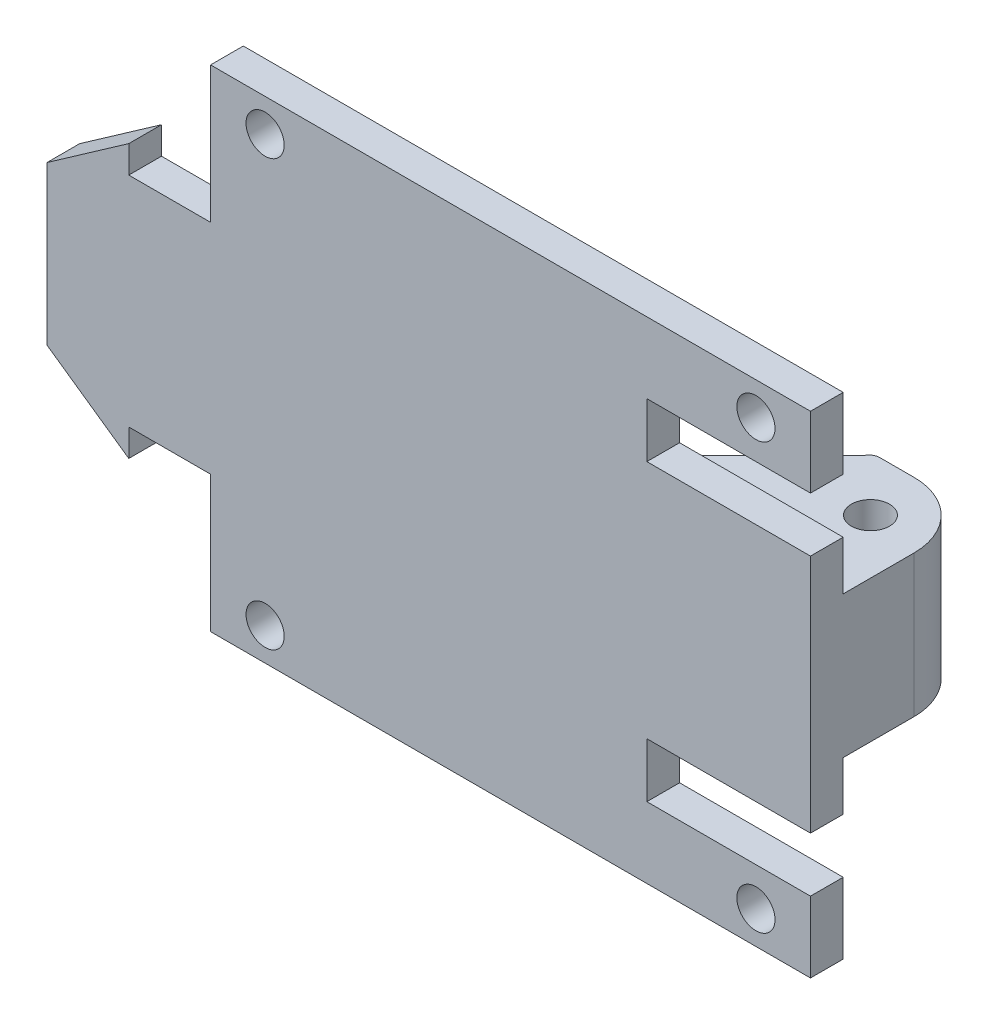
ISO-10303-21;
HEADER;
FILE_DESCRIPTION(('STEP AP214'),'2;1');
FILE_NAME('part.step','',(''),(''),'','','');
FILE_SCHEMA(('AUTOMOTIVE_DESIGN { 1 0 10303 214 1 1 1 1 }'));
ENDSEC;
DATA;
#1=APPLICATION_CONTEXT('core data for automotive mechanical design processes');
#2=APPLICATION_PROTOCOL_DEFINITION('international standard','automotive_design',2000,#1);
#3=PRODUCT_CONTEXT('',#1,'mechanical');
#4=PRODUCT('Part','Part','',(#3));
#5=PRODUCT_RELATED_PRODUCT_CATEGORY('part','',(#4));
#6=PRODUCT_DEFINITION_FORMATION('','',#4);
#7=PRODUCT_DEFINITION_CONTEXT('part definition',#1,'design');
#8=PRODUCT_DEFINITION('design','',#6,#7);
#9=PRODUCT_DEFINITION_SHAPE('','',#8);
#10=(LENGTH_UNIT() NAMED_UNIT(*) SI_UNIT(.MILLI.,.METRE.));
#11=(NAMED_UNIT(*) PLANE_ANGLE_UNIT() SI_UNIT($,.RADIAN.));
#12=(NAMED_UNIT(*) SI_UNIT($,.STERADIAN.) SOLID_ANGLE_UNIT());
#13=UNCERTAINTY_MEASURE_WITH_UNIT(LENGTH_MEASURE(1.E-05),#10,'distance_accuracy_value','');
#14=(GEOMETRIC_REPRESENTATION_CONTEXT(3) GLOBAL_UNCERTAINTY_ASSIGNED_CONTEXT((#13)) GLOBAL_UNIT_ASSIGNED_CONTEXT((#10,
#11,#12)) REPRESENTATION_CONTEXT('',''));
#15=CARTESIAN_POINT('',(0.,0.,0.));
#16=DIRECTION('',(0.,0.,1.));
#17=DIRECTION('',(1.,0.,0.));
#18=AXIS2_PLACEMENT_3D('',#15,#16,#17);
#19=CARTESIAN_POINT('',(-44.4369973190349,19.343163538874,3.));
#20=DIRECTION('',(1.,0.,0.));
#21=DIRECTION('',(0.,1.,0.));
#22=AXIS2_PLACEMENT_3D('',#19,#20,#21);
#23=PLANE('',#22);
#24=DIRECTION('',(0.,0.,-1.));
#25=VECTOR('',#24,1.);
#26=CARTESIAN_POINT('',(-44.4369973190349,6.843163538874,3.));
#27=LINE('',#26,#25);
#28=CARTESIAN_POINT('',(-44.4369973190349,6.843163538874,3.));
#29=VERTEX_POINT('',#28);
#30=CARTESIAN_POINT('',(-44.4369973190349,6.843163538874,0.));
#31=VERTEX_POINT('',#30);
#32=EDGE_CURVE('E228',#29,#31,#27,.T.);
#33=ORIENTED_EDGE('',*,*,#32,.F.);
#34=DIRECTION('',(0.,-1.,0.));
#35=VECTOR('',#34,1.);
#36=CARTESIAN_POINT('',(-44.4369973190349,19.343163538874,3.));
#37=LINE('',#36,#35);
#38=CARTESIAN_POINT('',(-44.4369973190349,19.343163538874,3.));
#39=VERTEX_POINT('',#38);
#40=EDGE_CURVE('E215',#39,#29,#37,.T.);
#41=ORIENTED_EDGE('',*,*,#40,.F.);
#42=DIRECTION('',(0.,0.,-1.));
#43=VECTOR('',#42,1.);
#44=CARTESIAN_POINT('',(-44.4369973190349,19.343163538874,3.));
#45=LINE('',#44,#43);
#46=CARTESIAN_POINT('',(-44.4369973190349,19.343163538874,0.));
#47=VERTEX_POINT('',#46);
#48=EDGE_CURVE('E352',#39,#47,#45,.T.);
#49=ORIENTED_EDGE('',*,*,#48,.T.);
#50=DIRECTION('',(0.,-1.,0.));
#51=VECTOR('',#50,1.);
#52=CARTESIAN_POINT('',(-44.4369973190349,19.343163538874,0.));
#53=LINE('',#52,#51);
#54=EDGE_CURVE('E353',#47,#31,#53,.T.);
#55=ORIENTED_EDGE('',*,*,#54,.T.);
#56=EDGE_LOOP('',(#33,#41,#49,#55));
#57=FACE_BOUND('',#56,.T.);
#58=ADVANCED_FACE('F33',(#57),#23,.F.);
#59=CARTESIAN_POINT('',(10.5630026809652,19.343163538874,3.));
#60=DIRECTION('',(-1.,0.,0.));
#61=DIRECTION('',(0.,-1.,0.));
#62=AXIS2_PLACEMENT_3D('',#59,#60,#61);
#63=PLANE('',#62);
#64=DIRECTION('',(0.,0.,-1.));
#65=VECTOR('',#64,1.);
#66=CARTESIAN_POINT('',(10.5630026809652,-19.156836461126,3.));
#67=LINE('',#66,#65);
#68=CARTESIAN_POINT('',(10.5630026809652,-19.156836461126,3.));
#69=VERTEX_POINT('',#68);
#70=CARTESIAN_POINT('',(10.5630026809652,-19.156836461126,0.));
#71=VERTEX_POINT('',#70);
#72=EDGE_CURVE('E302',#69,#71,#67,.T.);
#73=ORIENTED_EDGE('',*,*,#72,.F.);
#74=DIRECTION('',(0.,1.,0.));
#75=VECTOR('',#74,1.);
#76=CARTESIAN_POINT('',(10.5630026809652,19.343163538874,3.));
#77=LINE('',#76,#75);
#78=CARTESIAN_POINT('',(10.5630026809652,-25.656836461126,3.));
#79=VERTEX_POINT('',#78);
#80=EDGE_CURVE('E347',#79,#69,#77,.T.);
#81=ORIENTED_EDGE('',*,*,#80,.F.);
#82=DIRECTION('',(0.,0.,-1.));
#83=VECTOR('',#82,1.);
#84=CARTESIAN_POINT('',(10.5630026809652,-25.656836461126,3.));
#85=LINE('',#84,#83);
#86=CARTESIAN_POINT('',(10.5630026809652,-25.656836461126,0.));
#87=VERTEX_POINT('',#86);
#88=EDGE_CURVE('E371',#79,#87,#85,.T.);
#89=ORIENTED_EDGE('',*,*,#88,.T.);
#90=DIRECTION('',(0.,1.,0.));
#91=VECTOR('',#90,1.);
#92=CARTESIAN_POINT('',(10.5630026809652,19.343163538874,0.));
#93=LINE('',#92,#91);
#94=EDGE_CURVE('E359',#87,#71,#93,.T.);
#95=ORIENTED_EDGE('',*,*,#94,.T.);
#96=EDGE_LOOP('',(#73,#81,#89,#95));
#97=FACE_BOUND('',#96,.T.);
#98=ADVANCED_FACE('F463',(#97),#63,.F.);
#99=DIRECTION('',(0.,0.,1.));
#100=VECTOR('',#99,1.);
#101=CARTESIAN_POINT('',(10.5630026809652,-14.156836461126,3.));
#102=LINE('',#101,#100);
#103=CARTESIAN_POINT('',(10.5630026809652,-14.156836461126,0.));
#104=VERTEX_POINT('',#103);
#105=CARTESIAN_POINT('',(10.5630026809652,-14.156836461126,3.));
#106=VERTEX_POINT('',#105);
#107=EDGE_CURVE('E58',#104,#106,#102,.T.);
#108=ORIENTED_EDGE('',*,*,#107,.F.);
#109=CARTESIAN_POINT('',(10.5630026809652,-9.65683646112599,0.));
#110=VERTEX_POINT('',#109);
#111=EDGE_CURVE('E363',#104,#110,#93,.T.);
#112=ORIENTED_EDGE('',*,*,#111,.T.);
#113=DIRECTION('',(0.,0.,1.));
#114=VECTOR('',#113,1.);
#115=CARTESIAN_POINT('',(10.5630026809652,-9.656836461126,-12.5));
#116=LINE('',#115,#114);
#117=CARTESIAN_POINT('',(10.5630026809652,-9.656836461126,-6.5));
#118=VERTEX_POINT('',#117);
#119=EDGE_CURVE('E332',#118,#110,#116,.T.);
#120=ORIENTED_EDGE('',*,*,#119,.F.);
#121=DIRECTION('',(0.,-1.,0.));
#122=VECTOR('',#121,1.);
#123=CARTESIAN_POINT('',(10.5630026809652,3.343163538874,-6.5));
#124=LINE('',#123,#122);
#125=CARTESIAN_POINT('',(10.5630026809652,3.343163538874,-6.5));
#126=VERTEX_POINT('',#125);
#127=EDGE_CURVE('E384',#118,#126,#124,.F.);
#128=ORIENTED_EDGE('',*,*,#127,.T.);
#129=DIRECTION('',(0.,0.,1.));
#130=VECTOR('',#129,1.);
#131=CARTESIAN_POINT('',(10.5630026809652,3.343163538874,-12.5));
#132=LINE('',#131,#130);
#133=CARTESIAN_POINT('',(10.5630026809652,3.343163538874,0.));
#134=VERTEX_POINT('',#133);
#135=EDGE_CURVE('E339',#126,#134,#132,.T.);
#136=ORIENTED_EDGE('',*,*,#135,.T.);
#137=CARTESIAN_POINT('',(10.5630026809652,7.843163538874,0.));
#138=VERTEX_POINT('',#137);
#139=EDGE_CURVE('E364',#134,#138,#93,.T.);
#140=ORIENTED_EDGE('',*,*,#139,.T.);
#141=DIRECTION('',(0.,0.,1.));
#142=VECTOR('',#141,1.);
#143=CARTESIAN_POINT('',(10.5630026809652,7.843163538874,3.));
#144=LINE('',#143,#142);
#145=CARTESIAN_POINT('',(10.5630026809652,7.843163538874,3.));
#146=VERTEX_POINT('',#145);
#147=EDGE_CURVE('E319',#138,#146,#144,.T.);
#148=ORIENTED_EDGE('',*,*,#147,.T.);
#149=EDGE_CURVE('E350',#106,#146,#77,.T.);
#150=ORIENTED_EDGE('',*,*,#149,.F.);
#151=EDGE_LOOP('',(#108,#112,#120,#128,#136,#140,#148,#150));
#152=FACE_BOUND('',#151,.T.);
#153=ADVANCED_FACE('F452',(#152),#63,.F.);
#154=CARTESIAN_POINT('',(0.,0.,0.));
#155=DIRECTION('',(0.,0.,1.));
#156=DIRECTION('',(1.,0.,0.));
#157=AXIS2_PLACEMENT_3D('',#154,#155,#156);
#158=PLANE('',#157);
#159=CARTESIAN_POINT('',(5.56300268096515,-22.656836461126,0.));
#160=DIRECTION('',(0.,0.,-1.));
#161=DIRECTION('',(1.,0.,0.));
#162=AXIS2_PLACEMENT_3D('',#159,#160,#161);
#163=CIRCLE('',#162,1.75);
#164=CARTESIAN_POINT('',(7.31300268096515,-22.656836461126,0.));
#165=VERTEX_POINT('',#164);
#166=EDGE_CURVE('E263',#165,#165,#163,.T.);
#167=ORIENTED_EDGE('',*,*,#166,.F.);
#168=EDGE_LOOP('',(#167));
#169=FACE_BOUND('',#168,.T.);
#170=CARTESIAN_POINT('',(-39.4369973190349,16.343163538874,0.));
#171=DIRECTION('',(0.,0.,-1.));
#172=DIRECTION('',(-1.,0.,0.));
#173=AXIS2_PLACEMENT_3D('',#170,#171,#172);
#174=CIRCLE('',#173,1.75);
#175=CARTESIAN_POINT('',(-41.1869973190349,16.343163538874,0.));
#176=VERTEX_POINT('',#175);
#177=EDGE_CURVE('E280',#176,#176,#174,.T.);
#178=ORIENTED_EDGE('',*,*,#177,.F.);
#179=EDGE_LOOP('',(#178));
#180=FACE_BOUND('',#179,.T.);
#181=CARTESIAN_POINT('',(5.56300268096516,16.343163538874,0.));
#182=DIRECTION('',(0.,0.,-1.));
#183=DIRECTION('',(-1.,0.,0.));
#184=AXIS2_PLACEMENT_3D('',#181,#182,#183);
#185=CIRCLE('',#184,1.75);
#186=CARTESIAN_POINT('',(3.81300268096516,16.343163538874,0.));
#187=VERTEX_POINT('',#186);
#188=EDGE_CURVE('E276',#187,#187,#185,.T.);
#189=ORIENTED_EDGE('',*,*,#188,.F.);
#190=EDGE_LOOP('',(#189));
#191=FACE_BOUND('',#190,.T.);
#192=CARTESIAN_POINT('',(-39.4369973190349,-22.656836461126,0.));
#193=DIRECTION('',(0.,0.,-1.));
#194=DIRECTION('',(1.,0.,0.));
#195=AXIS2_PLACEMENT_3D('',#192,#193,#194);
#196=CIRCLE('',#195,1.75);
#197=CARTESIAN_POINT('',(-37.6869973190349,-22.656836461126,0.));
#198=VERTEX_POINT('',#197);
#199=EDGE_CURVE('E279',#198,#198,#196,.T.);
#200=ORIENTED_EDGE('',*,*,#199,.F.);
#201=EDGE_LOOP('',(#200));
#202=FACE_BOUND('',#201,.T.);
#203=DIRECTION('',(1.,0.,0.));
#204=VECTOR('',#203,1.);
#205=CARTESIAN_POINT('',(-4.43699731903485,-19.156836461126,0.));
#206=LINE('',#205,#204);
#207=CARTESIAN_POINT('',(-4.43699731903485,-19.156836461126,0.));
#208=VERTEX_POINT('',#207);
#209=EDGE_CURVE('E294',#208,#71,#206,.T.);
#210=ORIENTED_EDGE('',*,*,#209,.T.);
#211=ORIENTED_EDGE('',*,*,#94,.F.);
#212=DIRECTION('',(1.,0.,0.));
#213=VECTOR('',#212,1.);
#214=CARTESIAN_POINT('',(-44.4369973190348,-25.656836461126,0.));
#215=LINE('',#214,#213);
#216=CARTESIAN_POINT('',(-44.4369973190348,-25.656836461126,0.));
#217=VERTEX_POINT('',#216);
#218=EDGE_CURVE('E356',#217,#87,#215,.T.);
#219=ORIENTED_EDGE('',*,*,#218,.F.);
#220=CARTESIAN_POINT('',(-44.4369973190348,-13.156836461126,0.));
#221=VERTEX_POINT('',#220);
#222=EDGE_CURVE('E341',#221,#217,#53,.T.);
#223=ORIENTED_EDGE('',*,*,#222,.F.);
#224=DIRECTION('',(-1.,0.,0.));
#225=VECTOR('',#224,1.);
#226=CARTESIAN_POINT('',(-44.4369973190349,-13.156836461126,0.));
#227=LINE('',#226,#225);
#228=CARTESIAN_POINT('',(-51.9369973190349,-13.156836461126,0.));
#229=VERTEX_POINT('',#228);
#230=EDGE_CURVE('E50',#221,#229,#227,.T.);
#231=ORIENTED_EDGE('',*,*,#230,.T.);
#232=DIRECTION('',(0.,-1.,0.));
#233=VECTOR('',#232,1.);
#234=CARTESIAN_POINT('',(-51.9369973190349,-13.156836461126,0.));
#235=LINE('',#234,#233);
#236=CARTESIAN_POINT('',(-51.9369973190349,-15.656836461126,0.));
#237=VERTEX_POINT('',#236);
#238=EDGE_CURVE('E254',#229,#237,#235,.T.);
#239=ORIENTED_EDGE('',*,*,#238,.T.);
#240=DIRECTION('',(-0.819152044288989,0.57357643635105,0.));
#241=VECTOR('',#240,1.);
#242=CARTESIAN_POINT('',(-51.9369973190349,-15.656836461126,0.));
#243=LINE('',#242,#241);
#244=CARTESIAN_POINT('',(-59.4369973190349,-10.4052799245531,0.));
#245=VERTEX_POINT('',#244);
#246=EDGE_CURVE('E257',#237,#245,#243,.T.);
#247=ORIENTED_EDGE('',*,*,#246,.T.);
#248=DIRECTION('',(0.,-1.,0.));
#249=VECTOR('',#248,1.);
#250=CARTESIAN_POINT('',(-59.4369973190349,4.09160700230121,0.));
#251=LINE('',#250,#249);
#252=CARTESIAN_POINT('',(-59.4369973190349,4.09160700230121,0.));
#253=VERTEX_POINT('',#252);
#254=EDGE_CURVE('E236',#253,#245,#251,.T.);
#255=ORIENTED_EDGE('',*,*,#254,.F.);
#256=DIRECTION('',(-0.819152044288993,-0.573576436351044,0.));
#257=VECTOR('',#256,1.);
#258=CARTESIAN_POINT('',(-51.9369973190349,9.343163538874,0.));
#259=LINE('',#258,#257);
#260=CARTESIAN_POINT('',(-51.9369973190349,9.343163538874,0.));
#261=VERTEX_POINT('',#260);
#262=EDGE_CURVE('E234',#261,#253,#259,.T.);
#263=ORIENTED_EDGE('',*,*,#262,.F.);
#264=DIRECTION('',(0.,-1.,0.));
#265=VECTOR('',#264,1.);
#266=CARTESIAN_POINT('',(-51.9369973190349,9.343163538874,0.));
#267=LINE('',#266,#265);
#268=CARTESIAN_POINT('',(-51.9369973190349,6.843163538874,0.));
#269=VERTEX_POINT('',#268);
#270=EDGE_CURVE('E250',#261,#269,#267,.T.);
#271=ORIENTED_EDGE('',*,*,#270,.T.);
#272=DIRECTION('',(-1.,0.,0.));
#273=VECTOR('',#272,1.);
#274=CARTESIAN_POINT('',(-44.4369973190349,6.843163538874,0.));
#275=LINE('',#274,#273);
#276=EDGE_CURVE('E224',#31,#269,#275,.T.);
#277=ORIENTED_EDGE('',*,*,#276,.F.);
#278=ORIENTED_EDGE('',*,*,#54,.F.);
#279=DIRECTION('',(-1.,0.,0.));
#280=VECTOR('',#279,1.);
#281=CARTESIAN_POINT('',(-44.4369973190349,19.343163538874,0.));
#282=LINE('',#281,#280);
#283=CARTESIAN_POINT('',(10.5630026809652,19.343163538874,0.));
#284=VERTEX_POINT('',#283);
#285=EDGE_CURVE('E362',#284,#47,#282,.T.);
#286=ORIENTED_EDGE('',*,*,#285,.F.);
#287=CARTESIAN_POINT('',(10.5630026809652,12.843163538874,0.));
#288=VERTEX_POINT('',#287);
#289=EDGE_CURVE('E358',#288,#284,#93,.T.);
#290=ORIENTED_EDGE('',*,*,#289,.F.);
#291=DIRECTION('',(1.,0.,0.));
#292=VECTOR('',#291,1.);
#293=CARTESIAN_POINT('',(-4.43699731903484,12.843163538874,0.));
#294=LINE('',#293,#292);
#295=CARTESIAN_POINT('',(-4.43699731903484,12.843163538874,0.));
#296=VERTEX_POINT('',#295);
#297=EDGE_CURVE('E307',#296,#288,#294,.T.);
#298=ORIENTED_EDGE('',*,*,#297,.F.);
#299=DIRECTION('',(0.,1.,0.));
#300=VECTOR('',#299,1.);
#301=CARTESIAN_POINT('',(-4.43699731903484,7.843163538874,0.));
#302=LINE('',#301,#300);
#303=CARTESIAN_POINT('',(-4.43699731903484,7.843163538874,0.));
#304=VERTEX_POINT('',#303);
#305=EDGE_CURVE('E304',#304,#296,#302,.T.);
#306=ORIENTED_EDGE('',*,*,#305,.F.);
#307=DIRECTION('',(-1.,0.,0.));
#308=VECTOR('',#307,1.);
#309=CARTESIAN_POINT('',(-4.43699731903484,7.843163538874,0.));
#310=LINE('',#309,#308);
#311=EDGE_CURVE('E309',#138,#304,#310,.T.);
#312=ORIENTED_EDGE('',*,*,#311,.F.);
#313=ORIENTED_EDGE('',*,*,#139,.F.);
#314=DIRECTION('',(1.,0.,0.));
#315=VECTOR('',#314,1.);
#316=CARTESIAN_POINT('',(0.563002680965156,3.343163538874,0.));
#317=LINE('',#316,#315);
#318=CARTESIAN_POINT('',(-11.4369973190348,3.343163538874,0.));
#319=VERTEX_POINT('',#318);
#320=EDGE_CURVE('E333',#319,#134,#317,.T.);
#321=ORIENTED_EDGE('',*,*,#320,.F.);
#322=DIRECTION('',(0.,-1.,0.));
#323=VECTOR('',#322,1.);
#324=CARTESIAN_POINT('',(-11.4369973190348,-9.656836461126,0.));
#325=LINE('',#324,#323);
#326=CARTESIAN_POINT('',(-11.4369973190348,-9.65683646112599,0.));
#327=VERTEX_POINT('',#326);
#328=EDGE_CURVE('E392',#319,#327,#325,.T.);
#329=ORIENTED_EDGE('',*,*,#328,.T.);
#330=DIRECTION('',(-1.,0.,0.));
#331=VECTOR('',#330,1.);
#332=CARTESIAN_POINT('',(0.563002680965156,-9.656836461126,0.));
#333=LINE('',#332,#331);
#334=EDGE_CURVE('E329',#110,#327,#333,.T.);
#335=ORIENTED_EDGE('',*,*,#334,.F.);
#336=ORIENTED_EDGE('',*,*,#111,.F.);
#337=DIRECTION('',(-1.,0.,0.));
#338=VECTOR('',#337,1.);
#339=CARTESIAN_POINT('',(-4.43699731903485,-14.156836461126,0.));
#340=LINE('',#339,#338);
#341=CARTESIAN_POINT('',(-4.43699731903485,-14.156836461126,0.));
#342=VERTEX_POINT('',#341);
#343=EDGE_CURVE('E291',#104,#342,#340,.T.);
#344=ORIENTED_EDGE('',*,*,#343,.T.);
#345=DIRECTION('',(0.,-1.,0.));
#346=VECTOR('',#345,1.);
#347=CARTESIAN_POINT('',(-4.43699731903485,-14.156836461126,0.));
#348=LINE('',#347,#346);
#349=EDGE_CURVE('E288',#342,#208,#348,.T.);
#350=ORIENTED_EDGE('',*,*,#349,.T.);
#351=EDGE_LOOP('',(#210,#211,#219,#223,#231,#239,#247,#255,#263,#271,#277,#278,#286,#290,#298,
#306,#312,#313,#321,#329,#335,#336,#344,#350));
#352=FACE_BOUND('',#351,.T.);
#353=ADVANCED_FACE('F435',(#169,#180,#191,#202,#352),#158,.F.);
#354=CARTESIAN_POINT('',(0.,0.,3.));
#355=DIRECTION('',(0.,0.,1.));
#356=DIRECTION('',(1.,0.,0.));
#357=AXIS2_PLACEMENT_3D('',#354,#355,#356);
#358=PLANE('',#357);
#359=CARTESIAN_POINT('',(5.56300268096515,-22.656836461126,3.));
#360=DIRECTION('',(0.,0.,1.));
#361=DIRECTION('',(1.,0.,0.));
#362=AXIS2_PLACEMENT_3D('',#359,#360,#361);
#363=CIRCLE('',#362,1.75);
#364=CARTESIAN_POINT('',(7.31300268096515,-22.656836461126,3.));
#365=VERTEX_POINT('',#364);
#366=EDGE_CURVE('E37',#365,#365,#363,.T.);
#367=ORIENTED_EDGE('',*,*,#366,.F.);
#368=EDGE_LOOP('',(#367));
#369=FACE_BOUND('',#368,.T.);
#370=CARTESIAN_POINT('',(-39.4369973190349,16.343163538874,3.));
#371=DIRECTION('',(0.,0.,1.));
#372=DIRECTION('',(1.,0.,0.));
#373=AXIS2_PLACEMENT_3D('',#370,#371,#372);
#374=CIRCLE('',#373,1.75);
#375=CARTESIAN_POINT('',(-37.6869973190349,16.343163538874,3.));
#376=VERTEX_POINT('',#375);
#377=EDGE_CURVE('E422',#376,#376,#374,.T.);
#378=ORIENTED_EDGE('',*,*,#377,.F.);
#379=EDGE_LOOP('',(#378));
#380=FACE_BOUND('',#379,.T.);
#381=CARTESIAN_POINT('',(5.56300268096516,16.343163538874,3.));
#382=DIRECTION('',(0.,0.,1.));
#383=DIRECTION('',(1.,0.,0.));
#384=AXIS2_PLACEMENT_3D('',#381,#382,#383);
#385=CIRCLE('',#384,1.75);
#386=CARTESIAN_POINT('',(7.31300268096516,16.343163538874,3.));
#387=VERTEX_POINT('',#386);
#388=EDGE_CURVE('E420',#387,#387,#385,.T.);
#389=ORIENTED_EDGE('',*,*,#388,.F.);
#390=EDGE_LOOP('',(#389));
#391=FACE_BOUND('',#390,.T.);
#392=CARTESIAN_POINT('',(-39.4369973190349,-22.656836461126,3.));
#393=DIRECTION('',(0.,0.,1.));
#394=DIRECTION('',(1.,0.,0.));
#395=AXIS2_PLACEMENT_3D('',#392,#393,#394);
#396=CIRCLE('',#395,1.75);
#397=CARTESIAN_POINT('',(-37.6869973190349,-22.656836461126,3.));
#398=VERTEX_POINT('',#397);
#399=EDGE_CURVE('E287',#398,#398,#396,.T.);
#400=ORIENTED_EDGE('',*,*,#399,.F.);
#401=EDGE_LOOP('',(#400));
#402=FACE_BOUND('',#401,.T.);
#403=ORIENTED_EDGE('',*,*,#80,.T.);
#404=DIRECTION('',(-1.,0.,0.));
#405=VECTOR('',#404,1.);
#406=CARTESIAN_POINT('',(0.,-19.156836461126,3.));
#407=LINE('',#406,#405);
#408=CARTESIAN_POINT('',(-4.43699731903485,-19.156836461126,3.));
#409=VERTEX_POINT('',#408);
#410=EDGE_CURVE('E11',#69,#409,#407,.T.);
#411=ORIENTED_EDGE('',*,*,#410,.T.);
#412=DIRECTION('',(0.,1.,0.));
#413=VECTOR('',#412,1.);
#414=CARTESIAN_POINT('',(-4.43699731903484,0.,3.));
#415=LINE('',#414,#413);
#416=CARTESIAN_POINT('',(-4.43699731903485,-14.156836461126,3.));
#417=VERTEX_POINT('',#416);
#418=EDGE_CURVE('E42',#409,#417,#415,.T.);
#419=ORIENTED_EDGE('',*,*,#418,.T.);
#420=DIRECTION('',(1.,0.,0.));
#421=VECTOR('',#420,1.);
#422=CARTESIAN_POINT('',(0.,-14.156836461126,3.));
#423=LINE('',#422,#421);
#424=EDGE_CURVE('E414',#417,#106,#423,.T.);
#425=ORIENTED_EDGE('',*,*,#424,.T.);
#426=ORIENTED_EDGE('',*,*,#149,.T.);
#427=DIRECTION('',(1.,0.,0.));
#428=VECTOR('',#427,1.);
#429=CARTESIAN_POINT('',(0.,7.843163538874,3.));
#430=LINE('',#429,#428);
#431=CARTESIAN_POINT('',(-4.43699731903484,7.843163538874,3.));
#432=VERTEX_POINT('',#431);
#433=EDGE_CURVE('E411',#432,#146,#430,.T.);
#434=ORIENTED_EDGE('',*,*,#433,.F.);
#435=DIRECTION('',(0.,-1.,0.));
#436=VECTOR('',#435,1.);
#437=CARTESIAN_POINT('',(-4.43699731903484,0.,3.));
#438=LINE('',#437,#436);
#439=CARTESIAN_POINT('',(-4.43699731903484,12.843163538874,3.));
#440=VERTEX_POINT('',#439);
#441=EDGE_CURVE('E409',#440,#432,#438,.T.);
#442=ORIENTED_EDGE('',*,*,#441,.F.);
#443=DIRECTION('',(-1.,0.,0.));
#444=VECTOR('',#443,1.);
#445=CARTESIAN_POINT('',(0.,12.843163538874,3.));
#446=LINE('',#445,#444);
#447=CARTESIAN_POINT('',(10.5630026809652,12.843163538874,3.));
#448=VERTEX_POINT('',#447);
#449=EDGE_CURVE('E407',#448,#440,#446,.T.);
#450=ORIENTED_EDGE('',*,*,#449,.F.);
#451=CARTESIAN_POINT('',(10.5630026809652,19.343163538874,3.));
#452=VERTEX_POINT('',#451);
#453=EDGE_CURVE('E346',#448,#452,#77,.T.);
#454=ORIENTED_EDGE('',*,*,#453,.T.);
#455=DIRECTION('',(-1.,0.,0.));
#456=VECTOR('',#455,1.);
#457=CARTESIAN_POINT('',(-44.4369973190349,19.343163538874,3.));
#458=LINE('',#457,#456);
#459=EDGE_CURVE('E349',#452,#39,#458,.T.);
#460=ORIENTED_EDGE('',*,*,#459,.T.);
#461=ORIENTED_EDGE('',*,*,#40,.T.);
#462=DIRECTION('',(-1.,0.,0.));
#463=VECTOR('',#462,1.);
#464=CARTESIAN_POINT('',(-44.4369973190349,6.843163538874,3.));
#465=LINE('',#464,#463);
#466=CARTESIAN_POINT('',(-51.9369973190349,6.843163538874,3.));
#467=VERTEX_POINT('',#466);
#468=EDGE_CURVE('E208',#29,#467,#465,.T.);
#469=ORIENTED_EDGE('',*,*,#468,.T.);
#470=DIRECTION('',(0.,-1.,0.));
#471=VECTOR('',#470,1.);
#472=CARTESIAN_POINT('',(-51.9369973190349,9.343163538874,3.));
#473=LINE('',#472,#471);
#474=CARTESIAN_POINT('',(-51.9369973190349,9.343163538874,3.));
#475=VERTEX_POINT('',#474);
#476=EDGE_CURVE('E213',#475,#467,#473,.T.);
#477=ORIENTED_EDGE('',*,*,#476,.F.);
#478=DIRECTION('',(-0.819152044288993,-0.573576436351044,0.));
#479=VECTOR('',#478,1.);
#480=CARTESIAN_POINT('',(-51.9369973190349,9.343163538874,3.));
#481=LINE('',#480,#479);
#482=CARTESIAN_POINT('',(-59.4369973190349,4.09160700230121,3.));
#483=VERTEX_POINT('',#482);
#484=EDGE_CURVE('E229',#475,#483,#481,.T.);
#485=ORIENTED_EDGE('',*,*,#484,.T.);
#486=DIRECTION('',(0.,-1.,0.));
#487=VECTOR('',#486,1.);
#488=CARTESIAN_POINT('',(-59.4369973190349,4.09160700230121,3.));
#489=LINE('',#488,#487);
#490=CARTESIAN_POINT('',(-59.4369973190349,-10.4052799245531,3.));
#491=VERTEX_POINT('',#490);
#492=EDGE_CURVE('E247',#483,#491,#489,.T.);
#493=ORIENTED_EDGE('',*,*,#492,.T.);
#494=DIRECTION('',(-0.819152044288989,0.57357643635105,0.));
#495=VECTOR('',#494,1.);
#496=CARTESIAN_POINT('',(-51.9369973190349,-15.656836461126,3.));
#497=LINE('',#496,#495);
#498=CARTESIAN_POINT('',(-51.9369973190349,-15.656836461126,3.));
#499=VERTEX_POINT('',#498);
#500=EDGE_CURVE('E244',#499,#491,#497,.T.);
#501=ORIENTED_EDGE('',*,*,#500,.F.);
#502=DIRECTION('',(0.,-1.,0.));
#503=VECTOR('',#502,1.);
#504=CARTESIAN_POINT('',(-51.9369973190349,-13.156836461126,3.));
#505=LINE('',#504,#503);
#506=CARTESIAN_POINT('',(-51.9369973190349,-13.156836461126,3.));
#507=VERTEX_POINT('',#506);
#508=EDGE_CURVE('E241',#507,#499,#505,.T.);
#509=ORIENTED_EDGE('',*,*,#508,.F.);
#510=DIRECTION('',(-1.,0.,0.));
#511=VECTOR('',#510,1.);
#512=CARTESIAN_POINT('',(-44.4369973190349,-13.156836461126,3.));
#513=LINE('',#512,#511);
#514=CARTESIAN_POINT('',(-44.4369973190349,-13.156836461126,3.));
#515=VERTEX_POINT('',#514);
#516=EDGE_CURVE('E218',#515,#507,#513,.T.);
#517=ORIENTED_EDGE('',*,*,#516,.F.);
#518=CARTESIAN_POINT('',(-44.4369973190348,-25.656836461126,3.));
#519=VERTEX_POINT('',#518);
#520=EDGE_CURVE('E344',#515,#519,#37,.T.);
#521=ORIENTED_EDGE('',*,*,#520,.T.);
#522=DIRECTION('',(1.,0.,0.));
#523=VECTOR('',#522,1.);
#524=CARTESIAN_POINT('',(-44.4369973190348,-25.656836461126,3.));
#525=LINE('',#524,#523);
#526=EDGE_CURVE('E343',#519,#79,#525,.T.);
#527=ORIENTED_EDGE('',*,*,#526,.T.);
#528=EDGE_LOOP('',(#403,#411,#419,#425,#426,#434,#442,#450,#454,#460,#461,#469,#477,#485,#493,
#501,#509,#517,#521,#527));
#529=FACE_BOUND('',#528,.T.);
#530=ADVANCED_FACE('F211',(#369,#380,#391,#402,#529),#358,.T.);
#531=ORIENTED_EDGE('',*,*,#520,.F.);
#532=DIRECTION('',(0.,0.,-1.));
#533=VECTOR('',#532,1.);
#534=CARTESIAN_POINT('',(-44.4369973190349,-13.156836461126,3.));
#535=LINE('',#534,#533);
#536=EDGE_CURVE('E273',#515,#221,#535,.T.);
#537=ORIENTED_EDGE('',*,*,#536,.T.);
#538=ORIENTED_EDGE('',*,*,#222,.T.);
#539=DIRECTION('',(0.,0.,-1.));
#540=VECTOR('',#539,1.);
#541=CARTESIAN_POINT('',(-44.4369973190348,-25.656836461126,3.));
#542=LINE('',#541,#540);
#543=EDGE_CURVE('E374',#519,#217,#542,.T.);
#544=ORIENTED_EDGE('',*,*,#543,.F.);
#545=EDGE_LOOP('',(#531,#537,#538,#544));
#546=FACE_BOUND('',#545,.T.);
#547=ADVANCED_FACE('F434',(#546),#23,.F.);
#548=CARTESIAN_POINT('',(-44.4369973190348,-25.656836461126,3.));
#549=DIRECTION('',(0.,1.,0.));
#550=DIRECTION('',(0.,0.,1.));
#551=AXIS2_PLACEMENT_3D('',#548,#549,#550);
#552=PLANE('',#551);
#553=ORIENTED_EDGE('',*,*,#218,.T.);
#554=ORIENTED_EDGE('',*,*,#88,.F.);
#555=ORIENTED_EDGE('',*,*,#526,.F.);
#556=ORIENTED_EDGE('',*,*,#543,.T.);
#557=EDGE_LOOP('',(#553,#554,#555,#556));
#558=FACE_BOUND('',#557,.T.);
#559=ADVANCED_FACE('F468',(#558),#552,.F.);
#560=ORIENTED_EDGE('',*,*,#453,.F.);
#561=DIRECTION('',(0.,0.,-1.));
#562=VECTOR('',#561,1.);
#563=CARTESIAN_POINT('',(10.5630026809652,12.843163538874,3.));
#564=LINE('',#563,#562);
#565=EDGE_CURVE('E315',#448,#288,#564,.T.);
#566=ORIENTED_EDGE('',*,*,#565,.T.);
#567=ORIENTED_EDGE('',*,*,#289,.T.);
#568=DIRECTION('',(0.,0.,-1.));
#569=VECTOR('',#568,1.);
#570=CARTESIAN_POINT('',(10.5630026809652,19.343163538874,3.));
#571=LINE('',#570,#569);
#572=EDGE_CURVE('E368',#452,#284,#571,.T.);
#573=ORIENTED_EDGE('',*,*,#572,.F.);
#574=EDGE_LOOP('',(#560,#566,#567,#573));
#575=FACE_BOUND('',#574,.T.);
#576=ADVANCED_FACE('F542',(#575),#63,.F.);
#577=CARTESIAN_POINT('',(-44.4369973190349,19.343163538874,3.));
#578=DIRECTION('',(0.,-1.,0.));
#579=DIRECTION('',(0.,0.,-1.));
#580=AXIS2_PLACEMENT_3D('',#577,#578,#579);
#581=PLANE('',#580);
#582=ORIENTED_EDGE('',*,*,#285,.T.);
#583=ORIENTED_EDGE('',*,*,#48,.F.);
#584=ORIENTED_EDGE('',*,*,#459,.F.);
#585=ORIENTED_EDGE('',*,*,#572,.T.);
#586=EDGE_LOOP('',(#582,#583,#584,#585));
#587=FACE_BOUND('',#586,.T.);
#588=ADVANCED_FACE('F498',(#587),#581,.F.);
#589=CARTESIAN_POINT('',(0.563002680965156,3.343163538874,-12.5));
#590=DIRECTION('',(0.,-1.,0.));
#591=DIRECTION('',(1.,0.,0.));
#592=AXIS2_PLACEMENT_3D('',#589,#590,#591);
#593=PLANE('',#592);
#594=CARTESIAN_POINT('',(5.56300268096516,3.343163538874,-7.5));
#595=DIRECTION('',(0.,1.,0.));
#596=DIRECTION('',(-1.,0.,0.));
#597=AXIS2_PLACEMENT_3D('',#594,#595,#596);
#598=CIRCLE('',#597,1.75);
#599=CARTESIAN_POINT('',(3.81300268096516,3.343163538874,-7.5));
#600=VERTEX_POINT('',#599);
#601=EDGE_CURVE('E322',#600,#600,#598,.T.);
#602=ORIENTED_EDGE('',*,*,#601,.F.);
#603=EDGE_LOOP('',(#602));
#604=FACE_BOUND('',#603,.T.);
#605=DIRECTION('',(1.,0.,0.));
#606=VECTOR('',#605,1.);
#607=CARTESIAN_POINT('',(0.563002680965156,3.343163538874,-12.5));
#608=LINE('',#607,#606);
#609=CARTESIAN_POINT('',(1.42902808474956,3.343163538874,-12.5));
#610=VERTEX_POINT('',#609);
#611=CARTESIAN_POINT('',(4.56300268096516,3.343163538874,-12.5));
#612=VERTEX_POINT('',#611);
#613=EDGE_CURVE('E326',#610,#612,#608,.T.);
#614=ORIENTED_EDGE('',*,*,#613,.F.);
#615=CARTESIAN_POINT('',(1.42902808474956,3.343163538874,-11.5));
#616=DIRECTION('',(0.,-1.,0.));
#617=DIRECTION('',(1.,0.,0.));
#618=AXIS2_PLACEMENT_3D('',#615,#616,#617);
#619=CIRCLE('',#618,1.);
#620=CARTESIAN_POINT('',(0.563002680965156,3.343163538874,-12.0000000000001));
#621=VERTEX_POINT('',#620);
#622=EDGE_CURVE('E403',#610,#621,#619,.F.);
#623=ORIENTED_EDGE('',*,*,#622,.T.);
#624=DIRECTION('',(0.707106781186544,0.,-0.707106781186551));
#625=VECTOR('',#624,1.);
#626=CARTESIAN_POINT('',(0.813002680965123,3.343163538874,-12.25));
#627=LINE('',#626,#625);
#628=EDGE_CURVE('E395',#621,#319,#627,.F.);
#629=ORIENTED_EDGE('',*,*,#628,.T.);
#630=ORIENTED_EDGE('',*,*,#320,.T.);
#631=ORIENTED_EDGE('',*,*,#135,.F.);
#632=CARTESIAN_POINT('',(4.56300268096516,3.343163538874,-6.5));
#633=DIRECTION('',(0.,-1.,0.));
#634=DIRECTION('',(1.,0.,0.));
#635=AXIS2_PLACEMENT_3D('',#632,#633,#634);
#636=CIRCLE('',#635,6.);
#637=EDGE_CURVE('E386',#126,#612,#636,.F.);
#638=ORIENTED_EDGE('',*,*,#637,.T.);
#639=EDGE_LOOP('',(#614,#623,#629,#630,#631,#638));
#640=FACE_BOUND('',#639,.T.);
#641=ADVANCED_FACE('F529',(#604,#640),#593,.F.);
#642=CARTESIAN_POINT('',(0.563002680965156,-9.656836461126,-12.5));
#643=DIRECTION('',(0.,1.,0.));
#644=DIRECTION('',(-1.,0.,0.));
#645=AXIS2_PLACEMENT_3D('',#642,#643,#644);
#646=PLANE('',#645);
#647=CARTESIAN_POINT('',(5.56300268096516,-9.656836461126,-7.5));
#648=DIRECTION('',(0.,1.,0.));
#649=DIRECTION('',(-1.,0.,0.));
#650=AXIS2_PLACEMENT_3D('',#647,#648,#649);
#651=CIRCLE('',#650,1.75);
#652=CARTESIAN_POINT('',(3.81300268096516,-9.656836461126,-7.5));
#653=VERTEX_POINT('',#652);
#654=EDGE_CURVE('E325',#653,#653,#651,.T.);
#655=ORIENTED_EDGE('',*,*,#654,.T.);
#656=EDGE_LOOP('',(#655));
#657=FACE_BOUND('',#656,.T.);
#658=DIRECTION('',(-0.707106781186544,0.,0.707106781186551));
#659=VECTOR('',#658,1.);
#660=CARTESIAN_POINT('',(0.813002680965123,-9.656836461126,-12.25));
#661=LINE('',#660,#659);
#662=CARTESIAN_POINT('',(0.563002680965156,-9.656836461126,-12.0000000000001));
#663=VERTEX_POINT('',#662);
#664=EDGE_CURVE('E398',#327,#663,#661,.F.);
#665=ORIENTED_EDGE('',*,*,#664,.T.);
#666=CARTESIAN_POINT('',(1.42902808474956,-9.656836461126,-11.5));
#667=DIRECTION('',(0.,1.,0.));
#668=DIRECTION('',(-1.,0.,0.));
#669=AXIS2_PLACEMENT_3D('',#666,#667,#668);
#670=CIRCLE('',#669,1.);
#671=CARTESIAN_POINT('',(1.42902808474956,-9.656836461126,-12.5));
#672=VERTEX_POINT('',#671);
#673=EDGE_CURVE('E405',#663,#672,#670,.F.);
#674=ORIENTED_EDGE('',*,*,#673,.T.);
#675=DIRECTION('',(-1.,0.,0.));
#676=VECTOR('',#675,1.);
#677=CARTESIAN_POINT('',(0.563002680965156,-9.656836461126,-12.5));
#678=LINE('',#677,#676);
#679=CARTESIAN_POINT('',(4.56300268096516,-9.656836461126,-12.5));
#680=VERTEX_POINT('',#679);
#681=EDGE_CURVE('E328',#680,#672,#678,.T.);
#682=ORIENTED_EDGE('',*,*,#681,.F.);
#683=CARTESIAN_POINT('',(4.56300268096516,-9.656836461126,-6.5));
#684=DIRECTION('',(0.,1.,0.));
#685=DIRECTION('',(-1.,0.,0.));
#686=AXIS2_PLACEMENT_3D('',#683,#684,#685);
#687=CIRCLE('',#686,6.);
#688=EDGE_CURVE('E382',#680,#118,#687,.F.);
#689=ORIENTED_EDGE('',*,*,#688,.T.);
#690=ORIENTED_EDGE('',*,*,#119,.T.);
#691=ORIENTED_EDGE('',*,*,#334,.T.);
#692=EDGE_LOOP('',(#665,#674,#682,#689,#690,#691));
#693=FACE_BOUND('',#692,.T.);
#694=ADVANCED_FACE('F512',(#657,#693),#646,.F.);
#695=CARTESIAN_POINT('',(0.,0.,-12.5));
#696=DIRECTION('',(0.,0.,-1.));
#697=DIRECTION('',(-1.,0.,0.));
#698=AXIS2_PLACEMENT_3D('',#695,#696,#697);
#699=PLANE('',#698);
#700=ORIENTED_EDGE('',*,*,#681,.T.);
#701=DIRECTION('',(0.,-1.,0.));
#702=VECTOR('',#701,1.);
#703=CARTESIAN_POINT('',(1.42902808474956,3.343163538874,-12.5));
#704=LINE('',#703,#702);
#705=EDGE_CURVE('E400',#672,#610,#704,.F.);
#706=ORIENTED_EDGE('',*,*,#705,.T.);
#707=ORIENTED_EDGE('',*,*,#613,.T.);
#708=DIRECTION('',(0.,-1.,0.));
#709=VECTOR('',#708,1.);
#710=CARTESIAN_POINT('',(4.56300268096516,-9.656836461126,-12.5));
#711=LINE('',#710,#709);
#712=EDGE_CURVE('E377',#612,#680,#711,.T.);
#713=ORIENTED_EDGE('',*,*,#712,.T.);
#714=EDGE_LOOP('',(#700,#706,#707,#713));
#715=FACE_BOUND('',#714,.T.);
#716=ADVANCED_FACE('F525',(#715),#699,.T.);
#717=CARTESIAN_POINT('',(5.56300268096516,-10.156836461126,-7.5));
#718=DIRECTION('',(0.,1.,0.));
#719=DIRECTION('',(-1.,0.,0.));
#720=AXIS2_PLACEMENT_3D('',#717,#718,#719);
#721=CYLINDRICAL_SURFACE('',#720,1.75);
#722=ORIENTED_EDGE('',*,*,#601,.T.);
#723=EDGE_LOOP('',(#722));
#724=FACE_BOUND('',#723,.T.);
#725=ORIENTED_EDGE('',*,*,#654,.F.);
#726=EDGE_LOOP('',(#725));
#727=FACE_BOUND('',#726,.T.);
#728=ADVANCED_FACE('F582',(#724,#727),#721,.F.);
#729=CARTESIAN_POINT('',(4.56300268096516,0.,-6.5));
#730=DIRECTION('',(0.,1.,0.));
#731=DIRECTION('',(-1.,0.,0.));
#732=AXIS2_PLACEMENT_3D('',#729,#730,#731);
#733=CYLINDRICAL_SURFACE('',#732,6.);
#734=ORIENTED_EDGE('',*,*,#637,.F.);
#735=ORIENTED_EDGE('',*,*,#127,.F.);
#736=ORIENTED_EDGE('',*,*,#688,.F.);
#737=ORIENTED_EDGE('',*,*,#712,.F.);
#738=EDGE_LOOP('',(#734,#735,#736,#737));
#739=FACE_BOUND('',#738,.T.);
#740=ADVANCED_FACE('F533',(#739),#733,.T.);
#741=CARTESIAN_POINT('',(0.563002680965156,-9.656836461126,-12.0000000000001));
#742=DIRECTION('',(-0.707106781186551,0.,-0.707106781186544));
#743=DIRECTION('',(0.,-1.,0.));
#744=AXIS2_PLACEMENT_3D('',#741,#742,#743);
#745=PLANE('',#744);
#746=ORIENTED_EDGE('',*,*,#664,.F.);
#747=ORIENTED_EDGE('',*,*,#328,.F.);
#748=ORIENTED_EDGE('',*,*,#628,.F.);
#749=DIRECTION('',(0.,1.,0.));
#750=VECTOR('',#749,1.);
#751=CARTESIAN_POINT('',(0.563002680965156,3.343163538874,-12.0000000000001));
#752=LINE('',#751,#750);
#753=EDGE_CURVE('E389',#663,#621,#752,.T.);
#754=ORIENTED_EDGE('',*,*,#753,.F.);
#755=EDGE_LOOP('',(#746,#747,#748,#754));
#756=FACE_BOUND('',#755,.T.);
#757=ADVANCED_FACE('F520',(#756),#745,.T.);
#758=CARTESIAN_POINT('',(1.42902808474956,-9.656836461126,-11.5));
#759=DIRECTION('',(0.,1.,0.));
#760=DIRECTION('',(0.,0.,1.));
#761=AXIS2_PLACEMENT_3D('',#758,#759,#760);
#762=CYLINDRICAL_SURFACE('',#761,1.);
#763=ORIENTED_EDGE('',*,*,#673,.F.);
#764=ORIENTED_EDGE('',*,*,#753,.T.);
#765=ORIENTED_EDGE('',*,*,#622,.F.);
#766=ORIENTED_EDGE('',*,*,#705,.F.);
#767=EDGE_LOOP('',(#763,#764,#765,#766));
#768=FACE_BOUND('',#767,.T.);
#769=ADVANCED_FACE('F35',(#768),#762,.T.);
#770=CARTESIAN_POINT('',(-4.43699731903484,7.843163538874,5.));
#771=DIRECTION('',(0.,-1.,0.));
#772=DIRECTION('',(1.,0.,0.));
#773=AXIS2_PLACEMENT_3D('',#770,#771,#772);
#774=PLANE('',#773);
#775=ORIENTED_EDGE('',*,*,#311,.T.);
#776=DIRECTION('',(0.,0.,-1.));
#777=VECTOR('',#776,1.);
#778=CARTESIAN_POINT('',(-4.43699731903484,7.843163538874,5.));
#779=LINE('',#778,#777);
#780=EDGE_CURVE('E313',#432,#304,#779,.T.);
#781=ORIENTED_EDGE('',*,*,#780,.F.);
#782=ORIENTED_EDGE('',*,*,#433,.T.);
#783=ORIENTED_EDGE('',*,*,#147,.F.);
#784=EDGE_LOOP('',(#775,#781,#782,#783));
#785=FACE_BOUND('',#784,.T.);
#786=ADVANCED_FACE('F537',(#785),#774,.F.);
#787=CARTESIAN_POINT('',(-4.43699731903484,12.843163538874,5.));
#788=DIRECTION('',(0.,1.,0.));
#789=DIRECTION('',(0.,0.,1.));
#790=AXIS2_PLACEMENT_3D('',#787,#788,#789);
#791=PLANE('',#790);
#792=ORIENTED_EDGE('',*,*,#449,.T.);
#793=DIRECTION('',(0.,0.,-1.));
#794=VECTOR('',#793,1.);
#795=CARTESIAN_POINT('',(-4.43699731903484,12.843163538874,5.));
#796=LINE('',#795,#794);
#797=EDGE_CURVE('E312',#440,#296,#796,.T.);
#798=ORIENTED_EDGE('',*,*,#797,.T.);
#799=ORIENTED_EDGE('',*,*,#297,.T.);
#800=ORIENTED_EDGE('',*,*,#565,.F.);
#801=EDGE_LOOP('',(#792,#798,#799,#800));
#802=FACE_BOUND('',#801,.T.);
#803=ADVANCED_FACE('F645',(#802),#791,.F.);
#804=CARTESIAN_POINT('',(-4.43699731903484,7.843163538874,5.));
#805=DIRECTION('',(-1.,0.,0.));
#806=DIRECTION('',(0.,0.,1.));
#807=AXIS2_PLACEMENT_3D('',#804,#805,#806);
#808=PLANE('',#807);
#809=ORIENTED_EDGE('',*,*,#441,.T.);
#810=ORIENTED_EDGE('',*,*,#780,.T.);
#811=ORIENTED_EDGE('',*,*,#305,.T.);
#812=ORIENTED_EDGE('',*,*,#797,.F.);
#813=EDGE_LOOP('',(#809,#810,#811,#812));
#814=FACE_BOUND('',#813,.T.);
#815=ADVANCED_FACE('F654',(#814),#808,.F.);
#816=CARTESIAN_POINT('',(-4.43699731903485,-19.156836461126,5.));
#817=DIRECTION('',(0.,1.,0.));
#818=DIRECTION('',(-1.,0.,0.));
#819=AXIS2_PLACEMENT_3D('',#816,#817,#818);
#820=PLANE('',#819);
#821=ORIENTED_EDGE('',*,*,#72,.T.);
#822=ORIENTED_EDGE('',*,*,#209,.F.);
#823=DIRECTION('',(0.,0.,-1.));
#824=VECTOR('',#823,1.);
#825=CARTESIAN_POINT('',(-4.43699731903485,-19.156836461126,5.));
#826=LINE('',#825,#824);
#827=EDGE_CURVE('E298',#409,#208,#826,.T.);
#828=ORIENTED_EDGE('',*,*,#827,.F.);
#829=ORIENTED_EDGE('',*,*,#410,.F.);
#830=EDGE_LOOP('',(#821,#822,#828,#829));
#831=FACE_BOUND('',#830,.T.);
#832=ADVANCED_FACE('F664',(#831),#820,.T.);
#833=CARTESIAN_POINT('',(-4.43699731903485,-14.156836461126,5.));
#834=DIRECTION('',(0.,-1.,0.));
#835=DIRECTION('',(1.,0.,0.));
#836=AXIS2_PLACEMENT_3D('',#833,#834,#835);
#837=PLANE('',#836);
#838=ORIENTED_EDGE('',*,*,#107,.T.);
#839=ORIENTED_EDGE('',*,*,#424,.F.);
#840=DIRECTION('',(0.,0.,-1.));
#841=VECTOR('',#840,1.);
#842=CARTESIAN_POINT('',(-4.43699731903485,-14.156836461126,5.));
#843=LINE('',#842,#841);
#844=EDGE_CURVE('E297',#417,#342,#843,.T.);
#845=ORIENTED_EDGE('',*,*,#844,.T.);
#846=ORIENTED_EDGE('',*,*,#343,.F.);
#847=EDGE_LOOP('',(#838,#839,#845,#846));
#848=FACE_BOUND('',#847,.T.);
#849=ADVANCED_FACE('F689',(#848),#837,.T.);
#850=CARTESIAN_POINT('',(-4.43699731903485,-14.156836461126,5.));
#851=DIRECTION('',(1.,0.,0.));
#852=DIRECTION('',(0.,1.,0.));
#853=AXIS2_PLACEMENT_3D('',#850,#851,#852);
#854=PLANE('',#853);
#855=ORIENTED_EDGE('',*,*,#827,.T.);
#856=ORIENTED_EDGE('',*,*,#349,.F.);
#857=ORIENTED_EDGE('',*,*,#844,.F.);
#858=ORIENTED_EDGE('',*,*,#418,.F.);
#859=EDGE_LOOP('',(#855,#856,#857,#858));
#860=FACE_BOUND('',#859,.T.);
#861=ADVANCED_FACE('F446',(#860),#854,.T.);
#862=CARTESIAN_POINT('',(-39.4369973190349,-22.656836461126,5.));
#863=DIRECTION('',(0.,0.,-1.));
#864=DIRECTION('',(-1.,0.,0.));
#865=AXIS2_PLACEMENT_3D('',#862,#863,#864);
#866=CYLINDRICAL_SURFACE('',#865,1.75);
#867=ORIENTED_EDGE('',*,*,#399,.T.);
#868=EDGE_LOOP('',(#867));
#869=FACE_BOUND('',#868,.T.);
#870=ORIENTED_EDGE('',*,*,#199,.T.);
#871=EDGE_LOOP('',(#870));
#872=FACE_BOUND('',#871,.T.);
#873=ADVANCED_FACE('F442',(#869,#872),#866,.F.);
#874=CARTESIAN_POINT('',(5.56300268096516,16.343163538874,5.));
#875=DIRECTION('',(0.,0.,-1.));
#876=DIRECTION('',(-1.,0.,0.));
#877=AXIS2_PLACEMENT_3D('',#874,#875,#876);
#878=CYLINDRICAL_SURFACE('',#877,1.75);
#879=ORIENTED_EDGE('',*,*,#388,.T.);
#880=EDGE_LOOP('',(#879));
#881=FACE_BOUND('',#880,.T.);
#882=ORIENTED_EDGE('',*,*,#188,.T.);
#883=EDGE_LOOP('',(#882));
#884=FACE_BOUND('',#883,.T.);
#885=ADVANCED_FACE('F445',(#881,#884),#878,.F.);
#886=CARTESIAN_POINT('',(-39.4369973190349,16.343163538874,5.));
#887=DIRECTION('',(0.,0.,-1.));
#888=DIRECTION('',(-1.,0.,0.));
#889=AXIS2_PLACEMENT_3D('',#886,#887,#888);
#890=CYLINDRICAL_SURFACE('',#889,1.75);
#891=ORIENTED_EDGE('',*,*,#377,.T.);
#892=EDGE_LOOP('',(#891));
#893=FACE_BOUND('',#892,.T.);
#894=ORIENTED_EDGE('',*,*,#177,.T.);
#895=EDGE_LOOP('',(#894));
#896=FACE_BOUND('',#895,.T.);
#897=ADVANCED_FACE('F721',(#893,#896),#890,.F.);
#898=CARTESIAN_POINT('',(5.56300268096515,-22.656836461126,5.));
#899=DIRECTION('',(0.,0.,-1.));
#900=DIRECTION('',(-1.,0.,0.));
#901=AXIS2_PLACEMENT_3D('',#898,#899,#900);
#902=CYLINDRICAL_SURFACE('',#901,1.75);
#903=ORIENTED_EDGE('',*,*,#366,.T.);
#904=EDGE_LOOP('',(#903));
#905=FACE_BOUND('',#904,.T.);
#906=ORIENTED_EDGE('',*,*,#166,.T.);
#907=EDGE_LOOP('',(#906));
#908=FACE_BOUND('',#907,.T.);
#909=ADVANCED_FACE('F429',(#905,#908),#902,.F.);
#910=CARTESIAN_POINT('',(-51.9369973190349,9.343163538874,3.));
#911=DIRECTION('',(1.,0.,0.));
#912=DIRECTION('',(0.,0.,-1.));
#913=AXIS2_PLACEMENT_3D('',#910,#911,#912);
#914=PLANE('',#913);
#915=ORIENTED_EDGE('',*,*,#270,.F.);
#916=DIRECTION('',(0.,0.,-1.));
#917=VECTOR('',#916,1.);
#918=CARTESIAN_POINT('',(-51.9369973190349,9.343163538874,3.));
#919=LINE('',#918,#917);
#920=EDGE_CURVE('E232',#475,#261,#919,.T.);
#921=ORIENTED_EDGE('',*,*,#920,.F.);
#922=ORIENTED_EDGE('',*,*,#476,.T.);
#923=DIRECTION('',(0.,0.,-1.));
#924=VECTOR('',#923,1.);
#925=CARTESIAN_POINT('',(-51.9369973190349,6.843163538874,3.));
#926=LINE('',#925,#924);
#927=EDGE_CURVE('E221',#467,#269,#926,.T.);
#928=ORIENTED_EDGE('',*,*,#927,.T.);
#929=EDGE_LOOP('',(#915,#921,#922,#928));
#930=FACE_BOUND('',#929,.T.);
#931=ADVANCED_FACE('F231',(#930),#914,.T.);
#932=CARTESIAN_POINT('',(-51.9369973190349,9.343163538874,3.));
#933=DIRECTION('',(0.573576436351044,-0.819152044288993,0.));
#934=DIRECTION('',(0.819152044288994,0.573576436351044,0.));
#935=AXIS2_PLACEMENT_3D('',#932,#933,#934);
#936=PLANE('',#935);
#937=ORIENTED_EDGE('',*,*,#262,.T.);
#938=DIRECTION('',(0.,0.,-1.));
#939=VECTOR('',#938,1.);
#940=CARTESIAN_POINT('',(-59.4369973190349,4.09160700230121,3.));
#941=LINE('',#940,#939);
#942=EDGE_CURVE('E264',#483,#253,#941,.T.);
#943=ORIENTED_EDGE('',*,*,#942,.F.);
#944=ORIENTED_EDGE('',*,*,#484,.F.);
#945=ORIENTED_EDGE('',*,*,#920,.T.);
#946=EDGE_LOOP('',(#937,#943,#944,#945));
#947=FACE_BOUND('',#946,.T.);
#948=ADVANCED_FACE('F491',(#947),#936,.F.);
#949=CARTESIAN_POINT('',(-59.4369973190349,4.09160700230121,3.));
#950=DIRECTION('',(1.,0.,0.));
#951=DIRECTION('',(0.,0.,-1.));
#952=AXIS2_PLACEMENT_3D('',#949,#950,#951);
#953=PLANE('',#952);
#954=ORIENTED_EDGE('',*,*,#254,.T.);
#955=DIRECTION('',(0.,0.,-1.));
#956=VECTOR('',#955,1.);
#957=CARTESIAN_POINT('',(-59.4369973190349,-10.4052799245531,3.));
#958=LINE('',#957,#956);
#959=EDGE_CURVE('E267',#491,#245,#958,.T.);
#960=ORIENTED_EDGE('',*,*,#959,.F.);
#961=ORIENTED_EDGE('',*,*,#492,.F.);
#962=ORIENTED_EDGE('',*,*,#942,.T.);
#963=EDGE_LOOP('',(#954,#960,#961,#962));
#964=FACE_BOUND('',#963,.T.);
#965=ADVANCED_FACE('F488',(#964),#953,.F.);
#966=CARTESIAN_POINT('',(-51.9369973190349,-15.656836461126,3.));
#967=DIRECTION('',(-0.57357643635105,-0.819152044288989,0.));
#968=DIRECTION('',(0.819152044288989,-0.57357643635105,0.));
#969=AXIS2_PLACEMENT_3D('',#966,#967,#968);
#970=PLANE('',#969);
#971=ORIENTED_EDGE('',*,*,#246,.F.);
#972=DIRECTION('',(0.,0.,-1.));
#973=VECTOR('',#972,1.);
#974=CARTESIAN_POINT('',(-51.9369973190349,-15.656836461126,3.));
#975=LINE('',#974,#973);
#976=EDGE_CURVE('E269',#499,#237,#975,.T.);
#977=ORIENTED_EDGE('',*,*,#976,.F.);
#978=ORIENTED_EDGE('',*,*,#500,.T.);
#979=ORIENTED_EDGE('',*,*,#959,.T.);
#980=EDGE_LOOP('',(#971,#977,#978,#979));
#981=FACE_BOUND('',#980,.T.);
#982=ADVANCED_FACE('F484',(#981),#970,.T.);
#983=CARTESIAN_POINT('',(-51.9369973190349,-13.156836461126,3.));
#984=DIRECTION('',(1.,0.,0.));
#985=DIRECTION('',(0.,0.,-1.));
#986=AXIS2_PLACEMENT_3D('',#983,#984,#985);
#987=PLANE('',#986);
#988=ORIENTED_EDGE('',*,*,#238,.F.);
#989=DIRECTION('',(0.,0.,-1.));
#990=VECTOR('',#989,1.);
#991=CARTESIAN_POINT('',(-51.9369973190349,-13.156836461126,3.));
#992=LINE('',#991,#990);
#993=EDGE_CURVE('E271',#507,#229,#992,.T.);
#994=ORIENTED_EDGE('',*,*,#993,.F.);
#995=ORIENTED_EDGE('',*,*,#508,.T.);
#996=ORIENTED_EDGE('',*,*,#976,.T.);
#997=EDGE_LOOP('',(#988,#994,#995,#996));
#998=FACE_BOUND('',#997,.T.);
#999=ADVANCED_FACE('F479',(#998),#987,.T.);
#1000=CARTESIAN_POINT('',(-44.4369973190349,-13.156836461126,3.));
#1001=DIRECTION('',(0.,-1.,0.));
#1002=DIRECTION('',(0.,0.,-1.));
#1003=AXIS2_PLACEMENT_3D('',#1000,#1001,#1002);
#1004=PLANE('',#1003);
#1005=ORIENTED_EDGE('',*,*,#230,.F.);
#1006=ORIENTED_EDGE('',*,*,#536,.F.);
#1007=ORIENTED_EDGE('',*,*,#516,.T.);
#1008=ORIENTED_EDGE('',*,*,#993,.T.);
#1009=EDGE_LOOP('',(#1005,#1006,#1007,#1008));
#1010=FACE_BOUND('',#1009,.T.);
#1011=ADVANCED_FACE('F474',(#1010),#1004,.T.);
#1012=CARTESIAN_POINT('',(-44.4369973190349,6.843163538874,3.));
#1013=DIRECTION('',(0.,-1.,0.));
#1014=DIRECTION('',(0.,0.,-1.));
#1015=AXIS2_PLACEMENT_3D('',#1012,#1013,#1014);
#1016=PLANE('',#1015);
#1017=ORIENTED_EDGE('',*,*,#276,.T.);
#1018=ORIENTED_EDGE('',*,*,#927,.F.);
#1019=ORIENTED_EDGE('',*,*,#468,.F.);
#1020=ORIENTED_EDGE('',*,*,#32,.T.);
#1021=EDGE_LOOP('',(#1017,#1018,#1019,#1020));
#1022=FACE_BOUND('',#1021,.T.);
#1023=ADVANCED_FACE('F222',(#1022),#1016,.F.);
#1024=CLOSED_SHELL('',(#58,#98,#153,#353,#530,#547,#559,#576,#588,#641,#694,#716,#728,#740,#757,
#769,#786,#803,#815,#832,#849,#861,#873,#885,#897,#909,#931,#948,#965,#982,#999,#1011,#1023));
#1025=MANIFOLD_SOLID_BREP('B2',#1024);
#1026=ADVANCED_BREP_SHAPE_REPRESENTATION('',(#18,#1025),#14);
#1027=SHAPE_DEFINITION_REPRESENTATION(#9,#1026);
ENDSEC;
END-ISO-10303-21;
